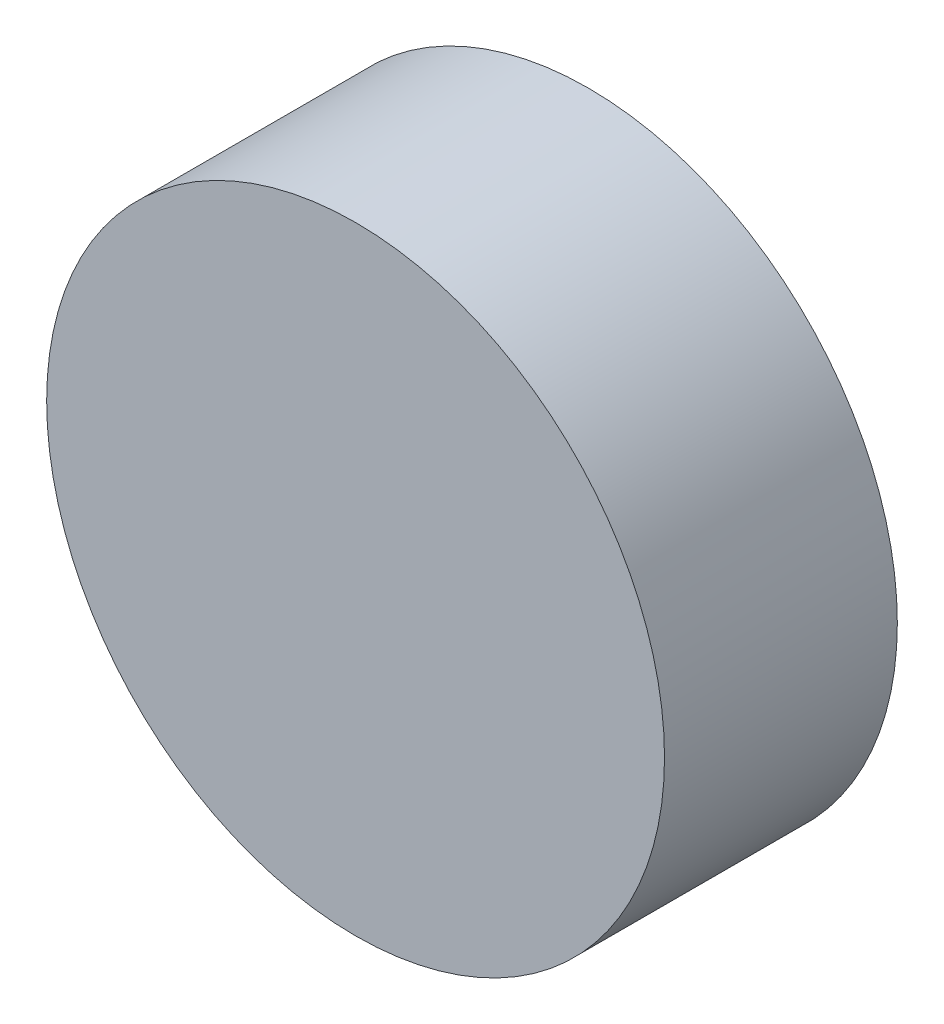
ISO-10303-21;
HEADER;
FILE_DESCRIPTION(('STEP AP214'),'2;1');
FILE_NAME('part.step','',(''),(''),'','','');
FILE_SCHEMA(('AUTOMOTIVE_DESIGN { 1 0 10303 214 1 1 1 1 }'));
ENDSEC;
DATA;
#1=APPLICATION_CONTEXT('core data for automotive mechanical design processes');
#2=APPLICATION_PROTOCOL_DEFINITION('international standard','automotive_design',2000,#1);
#3=PRODUCT_CONTEXT('',#1,'mechanical');
#4=PRODUCT('Part','Part','',(#3));
#5=PRODUCT_RELATED_PRODUCT_CATEGORY('part','',(#4));
#6=PRODUCT_DEFINITION_FORMATION('','',#4);
#7=PRODUCT_DEFINITION_CONTEXT('part definition',#1,'design');
#8=PRODUCT_DEFINITION('design','',#6,#7);
#9=PRODUCT_DEFINITION_SHAPE('','',#8);
#10=(LENGTH_UNIT() NAMED_UNIT(*) SI_UNIT(.MILLI.,.METRE.));
#11=(NAMED_UNIT(*) PLANE_ANGLE_UNIT() SI_UNIT($,.RADIAN.));
#12=(NAMED_UNIT(*) SI_UNIT($,.STERADIAN.) SOLID_ANGLE_UNIT());
#13=UNCERTAINTY_MEASURE_WITH_UNIT(LENGTH_MEASURE(1.E-05),#10,'distance_accuracy_value','');
#14=(GEOMETRIC_REPRESENTATION_CONTEXT(3) GLOBAL_UNCERTAINTY_ASSIGNED_CONTEXT((#13)) GLOBAL_UNIT_ASSIGNED_CONTEXT((#10,
#11,#12)) REPRESENTATION_CONTEXT('',''));
#15=CARTESIAN_POINT('',(0.,0.,0.));
#16=DIRECTION('',(0.,0.,1.));
#17=DIRECTION('',(1.,0.,0.));
#18=AXIS2_PLACEMENT_3D('',#15,#16,#17);
#19=CARTESIAN_POINT('',(0.,0.,26.));
#20=DIRECTION('',(0.,0.,-1.));
#21=DIRECTION('',(-1.,0.,0.));
#22=AXIS2_PLACEMENT_3D('',#19,#20,#21);
#23=CYLINDRICAL_SURFACE('',#22,34.5);
#24=CARTESIAN_POINT('',(0.,0.,26.));
#25=DIRECTION('',(0.,0.,1.));
#26=DIRECTION('',(1.,0.,0.));
#27=AXIS2_PLACEMENT_3D('',#24,#25,#26);
#28=CIRCLE('',#27,34.5);
#29=CARTESIAN_POINT('',(-34.5,0.,26.));
#30=VERTEX_POINT('',#29);
#31=EDGE_CURVE('E10',#30,#30,#28,.T.);
#32=CARTESIAN_POINT('',(0.,0.,0.));
#33=DIRECTION('',(0.,0.,1.));
#34=DIRECTION('',(1.,0.,0.));
#35=AXIS2_PLACEMENT_3D('',#32,#33,#34);
#36=CIRCLE('',#35,34.5);
#37=CARTESIAN_POINT('',(-34.5,0.,0.));
#38=VERTEX_POINT('',#37);
#39=EDGE_CURVE('E34',#38,#38,#36,.T.);
#40=CARTESIAN_POINT('',(-34.5,0.,26.));
#41=CARTESIAN_POINT('',(-34.5,0.,25.7291666666667));
#42=CARTESIAN_POINT('',(-34.5,0.,25.4583333333333));
#43=CARTESIAN_POINT('',(-34.5,0.,24.9166666666667));
#44=CARTESIAN_POINT('',(-34.5,0.,24.6458333333333));
#45=CARTESIAN_POINT('',(-34.5,0.,24.1041666666667));
#46=CARTESIAN_POINT('',(-34.5,0.,23.8333333333333));
#47=CARTESIAN_POINT('',(-34.5,0.,23.2916666666667));
#48=CARTESIAN_POINT('',(-34.5,0.,23.0208333333333));
#49=CARTESIAN_POINT('',(-34.5,0.,22.4791666666667));
#50=CARTESIAN_POINT('',(-34.5,0.,22.2083333333333));
#51=CARTESIAN_POINT('',(-34.5,0.,21.6666666666667));
#52=CARTESIAN_POINT('',(-34.5,0.,21.3958333333333));
#53=CARTESIAN_POINT('',(-34.5,0.,20.8541666666667));
#54=CARTESIAN_POINT('',(-34.5,0.,20.5833333333333));
#55=CARTESIAN_POINT('',(-34.5,0.,20.0416666666667));
#56=CARTESIAN_POINT('',(-34.5,0.,19.7708333333333));
#57=CARTESIAN_POINT('',(-34.5,0.,19.2291666666667));
#58=CARTESIAN_POINT('',(-34.5,0.,18.9583333333333));
#59=CARTESIAN_POINT('',(-34.5,0.,18.4166666666667));
#60=CARTESIAN_POINT('',(-34.5,0.,18.1458333333333));
#61=CARTESIAN_POINT('',(-34.5,0.,17.6041666666667));
#62=CARTESIAN_POINT('',(-34.5,0.,17.3333333333333));
#63=CARTESIAN_POINT('',(-34.5,0.,16.7916666666667));
#64=CARTESIAN_POINT('',(-34.5,0.,16.5208333333333));
#65=CARTESIAN_POINT('',(-34.5,0.,15.9791666666667));
#66=CARTESIAN_POINT('',(-34.5,0.,15.7083333333333));
#67=CARTESIAN_POINT('',(-34.5,0.,15.1666666666667));
#68=CARTESIAN_POINT('',(-34.5,0.,14.8958333333333));
#69=CARTESIAN_POINT('',(-34.5,0.,14.3541666666667));
#70=CARTESIAN_POINT('',(-34.5,0.,14.0833333333333));
#71=CARTESIAN_POINT('',(-34.5,0.,13.5416666666667));
#72=CARTESIAN_POINT('',(-34.5,0.,13.2708333333333));
#73=CARTESIAN_POINT('',(-34.5,0.,12.7291666666667));
#74=CARTESIAN_POINT('',(-34.5,0.,12.4583333333333));
#75=CARTESIAN_POINT('',(-34.5,0.,11.9166666666667));
#76=CARTESIAN_POINT('',(-34.5,0.,11.6458333333333));
#77=CARTESIAN_POINT('',(-34.5,0.,11.1041666666667));
#78=CARTESIAN_POINT('',(-34.5,0.,10.8333333333333));
#79=CARTESIAN_POINT('',(-34.5,0.,10.2916666666667));
#80=CARTESIAN_POINT('',(-34.5,0.,10.0208333333333));
#81=CARTESIAN_POINT('',(-34.5,0.,9.47916666666667));
#82=CARTESIAN_POINT('',(-34.5,0.,9.20833333333333));
#83=CARTESIAN_POINT('',(-34.5,0.,8.66666666666667));
#84=CARTESIAN_POINT('',(-34.5,0.,8.39583333333333));
#85=CARTESIAN_POINT('',(-34.5,0.,7.85416666666667));
#86=CARTESIAN_POINT('',(-34.5,0.,7.58333333333333));
#87=CARTESIAN_POINT('',(-34.5,0.,7.04166666666667));
#88=CARTESIAN_POINT('',(-34.5,0.,6.77083333333333));
#89=CARTESIAN_POINT('',(-34.5,0.,6.22916666666667));
#90=CARTESIAN_POINT('',(-34.5,0.,5.95833333333333));
#91=CARTESIAN_POINT('',(-34.5,0.,5.41666666666667));
#92=CARTESIAN_POINT('',(-34.5,0.,5.14583333333333));
#93=CARTESIAN_POINT('',(-34.5,0.,4.60416666666667));
#94=CARTESIAN_POINT('',(-34.5,0.,4.33333333333333));
#95=CARTESIAN_POINT('',(-34.5,0.,3.79166666666667));
#96=CARTESIAN_POINT('',(-34.5,0.,3.52083333333333));
#97=CARTESIAN_POINT('',(-34.5,0.,2.97916666666667));
#98=CARTESIAN_POINT('',(-34.5,0.,2.70833333333333));
#99=CARTESIAN_POINT('',(-34.5,0.,2.16666666666667));
#100=CARTESIAN_POINT('',(-34.5,0.,1.89583333333333));
#101=CARTESIAN_POINT('',(-34.5,0.,1.35416666666667));
#102=CARTESIAN_POINT('',(-34.5,0.,1.08333333333333));
#103=CARTESIAN_POINT('',(-34.5,0.,0.541666666666667));
#104=CARTESIAN_POINT('',(-34.5,0.,0.270833333333334));
#105=CARTESIAN_POINT('',(-34.5,0.,0.));
#106=B_SPLINE_CURVE_WITH_KNOTS('',3,(#40,#41,#42,#43,#44,#45,#46,#47,#48,#49,#50,#51,#52,#53,
#54,#55,#56,#57,#58,#59,#60,#61,#62,#63,#64,#65,#66,#67,#68,#69,#70,#71,#72,#73,#74,#75,#76,#77,
#78,#79,#80,#81,#82,#83,#84,#85,#86,#87,#88,#89,#90,#91,#92,#93,#94,#95,#96,#97,#98,#99,#100,
#101,#102,#103,#104,#105),.UNSPECIFIED.,.F.,.F.,(4,2,2,2,2,2,2,2,2,2,2,2,2,2,2,2,2,2,2,2,2,2,2,
2,2,2,2,2,2,2,2,2,4),(0.,0.812499999999997,1.625,2.4375,3.25,4.0625,4.875,5.6875,6.5,7.3125,
8.125,8.93749999999999,9.74999999999999,10.5625,11.375,12.1875,13.,13.8125,14.625,15.4375,16.25,
17.0625,17.875,18.6875,19.5,20.3125,21.125,21.9375,22.75,23.5625,24.375,25.1875,26.),.UNSPECIFIED.);
#107=EDGE_CURVE('BSEAM31',#30,#38,#106,.T.);
#108=ORIENTED_EDGE('',*,*,#31,.F.);
#109=ORIENTED_EDGE('',*,*,#39,.T.);
#110=ORIENTED_EDGE('',*,*,#107,.T.);
#111=ORIENTED_EDGE('',*,*,#107,.F.);
#112=EDGE_LOOP('',(#108,#110,#109,#111));
#113=FACE_BOUND('',#112,.T.);
#114=ADVANCED_FACE('F31',(#113),#23,.T.);
#115=CARTESIAN_POINT('',(0.,0.,26.));
#116=DIRECTION('',(0.,0.,1.));
#117=DIRECTION('',(1.,0.,0.));
#118=AXIS2_PLACEMENT_3D('',#115,#116,#117);
#119=PLANE('',#118);
#120=ORIENTED_EDGE('',*,*,#31,.T.);
#121=EDGE_LOOP('',(#120));
#122=FACE_BOUND('',#121,.T.);
#123=ADVANCED_FACE('F46',(#122),#119,.T.);
#124=CARTESIAN_POINT('',(0.,0.,0.));
#125=DIRECTION('',(0.,0.,1.));
#126=DIRECTION('',(1.,0.,0.));
#127=AXIS2_PLACEMENT_3D('',#124,#125,#126);
#128=PLANE('',#127);
#129=ORIENTED_EDGE('',*,*,#39,.F.);
#130=EDGE_LOOP('',(#129));
#131=FACE_BOUND('',#130,.T.);
#132=ADVANCED_FACE('F44',(#131),#128,.F.);
#133=CLOSED_SHELL('',(#114,#123,#132));
#134=MANIFOLD_SOLID_BREP('B2',#133);
#135=ADVANCED_BREP_SHAPE_REPRESENTATION('',(#18,#134),#14);
#136=SHAPE_DEFINITION_REPRESENTATION(#9,#135);
ENDSEC;
END-ISO-10303-21;
